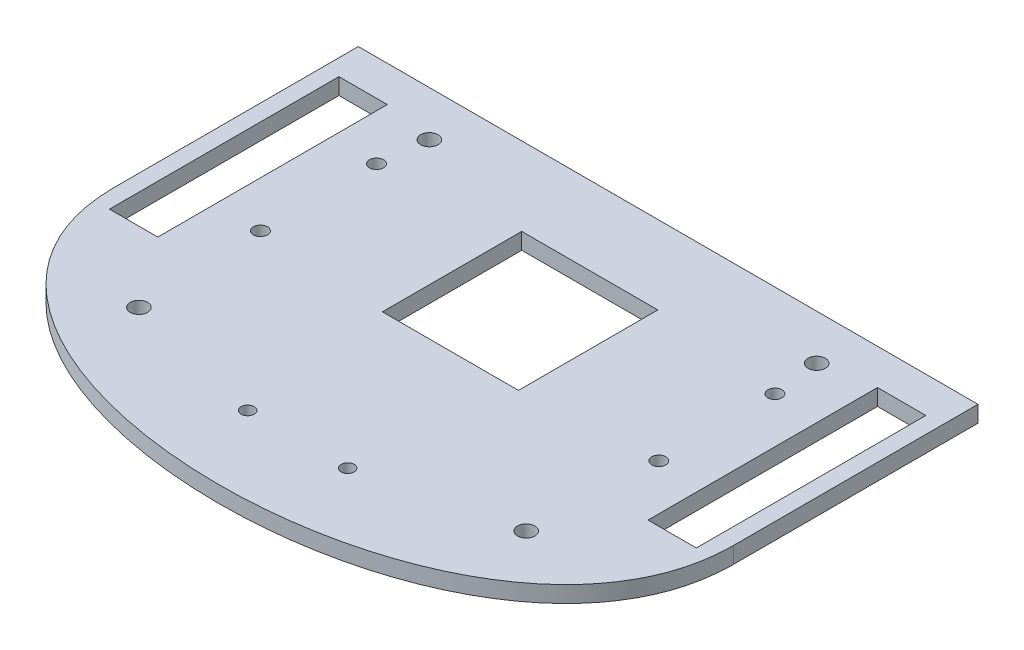
ISO-10303-21;
HEADER;
FILE_DESCRIPTION(('STEP AP214'),'2;1');
FILE_NAME('part.step','',(''),(''),'','','');
FILE_SCHEMA(('AUTOMOTIVE_DESIGN { 1 0 10303 214 1 1 1 1 }'));
ENDSEC;
DATA;
#1=APPLICATION_CONTEXT('core data for automotive mechanical design processes');
#2=APPLICATION_PROTOCOL_DEFINITION('international standard','automotive_design',2000,#1);
#3=PRODUCT_CONTEXT('',#1,'mechanical');
#4=PRODUCT('Part','Part','',(#3));
#5=PRODUCT_RELATED_PRODUCT_CATEGORY('part','',(#4));
#6=PRODUCT_DEFINITION_FORMATION('','',#4);
#7=PRODUCT_DEFINITION_CONTEXT('part definition',#1,'design');
#8=PRODUCT_DEFINITION('design','',#6,#7);
#9=PRODUCT_DEFINITION_SHAPE('','',#8);
#10=(LENGTH_UNIT() NAMED_UNIT(*) SI_UNIT(.MILLI.,.METRE.));
#11=(NAMED_UNIT(*) PLANE_ANGLE_UNIT() SI_UNIT($,.RADIAN.));
#12=(NAMED_UNIT(*) SI_UNIT($,.STERADIAN.) SOLID_ANGLE_UNIT());
#13=UNCERTAINTY_MEASURE_WITH_UNIT(LENGTH_MEASURE(1.E-05),#10,'distance_accuracy_value','');
#14=(GEOMETRIC_REPRESENTATION_CONTEXT(3) GLOBAL_UNCERTAINTY_ASSIGNED_CONTEXT((#13)) GLOBAL_UNIT_ASSIGNED_CONTEXT((#10,
#11,#12)) REPRESENTATION_CONTEXT('',''));
#15=CARTESIAN_POINT('',(0.,0.,0.));
#16=DIRECTION('',(0.,0.,1.));
#17=DIRECTION('',(1.,0.,0.));
#18=AXIS2_PLACEMENT_3D('',#15,#16,#17);
#19=CARTESIAN_POINT('',(-48.006,2.54,-34.798));
#20=DIRECTION('',(1.,0.,0.));
#21=DIRECTION('',(0.,0.,-1.));
#22=AXIS2_PLACEMENT_3D('',#19,#20,#21);
#23=PLANE('',#22);
#24=DIRECTION('',(0.,0.,1.));
#25=VECTOR('',#24,1.);
#26=CARTESIAN_POINT('',(-48.006,0.,-34.798));
#27=LINE('',#26,#25);
#28=CARTESIAN_POINT('',(-48.006,0.,-34.798));
#29=VERTEX_POINT('',#28);
#30=CARTESIAN_POINT('',(-48.006,0.,3.04800000000002));
#31=VERTEX_POINT('',#30);
#32=EDGE_CURVE('E314',#29,#31,#27,.T.);
#33=ORIENTED_EDGE('',*,*,#32,.T.);
#34=DIRECTION('',(0.,-1.,0.));
#35=VECTOR('',#34,1.);
#36=CARTESIAN_POINT('',(-48.006,2.54,3.04800000000002));
#37=LINE('',#36,#35);
#38=CARTESIAN_POINT('',(-48.006,2.54,3.04800000000002));
#39=VERTEX_POINT('',#38);
#40=EDGE_CURVE('E11',#39,#31,#37,.T.);
#41=ORIENTED_EDGE('',*,*,#40,.F.);
#42=DIRECTION('',(0.,0.,1.));
#43=VECTOR('',#42,1.);
#44=CARTESIAN_POINT('',(-48.006,2.54,-34.798));
#45=LINE('',#44,#43);
#46=CARTESIAN_POINT('',(-48.006,2.54,-34.798));
#47=VERTEX_POINT('',#46);
#48=EDGE_CURVE('E315',#47,#39,#45,.T.);
#49=ORIENTED_EDGE('',*,*,#48,.F.);
#50=DIRECTION('',(0.,-1.,0.));
#51=VECTOR('',#50,1.);
#52=CARTESIAN_POINT('',(-48.006,2.54,-34.798));
#53=LINE('',#52,#51);
#54=EDGE_CURVE('E441',#47,#29,#53,.T.);
#55=ORIENTED_EDGE('',*,*,#54,.T.);
#56=EDGE_LOOP('',(#33,#41,#49,#55));
#57=FACE_BOUND('',#56,.T.);
#58=ADVANCED_FACE('F32',(#57),#23,.F.);
#59=CARTESIAN_POINT('',(-48.006,2.54,3.04800000000002));
#60=CARTESIAN_POINT('',(-48.006,2.54,45.3813333333333));
#61=CARTESIAN_POINT('',(48.0060000000003,2.54,45.3813333333333));
#62=CARTESIAN_POINT('',(48.006,2.54,3.04800000000002));
#63=B_SPLINE_CURVE_WITH_KNOTS('',3,(#59,#60,#61,#62),.UNSPECIFIED.,.F.,.F.,(4,4),(0.,1.),.UNSPECIFIED.);
#64=DIRECTION('',(0.,-1.,0.));
#65=VECTOR('',#64,1.);
#66=SURFACE_OF_LINEAR_EXTRUSION('',#63,#65);
#67=CARTESIAN_POINT('',(-48.006,0.,3.04800000000002));
#68=CARTESIAN_POINT('',(-48.006,0.,45.3813333333333));
#69=CARTESIAN_POINT('',(48.0060000000003,0.,45.3813333333333));
#70=CARTESIAN_POINT('',(48.006,0.,3.04800000000002));
#71=B_SPLINE_CURVE_WITH_KNOTS('',3,(#67,#68,#69,#70),.UNSPECIFIED.,.F.,.F.,(4,4),(0.,1.),.UNSPECIFIED.);
#72=CARTESIAN_POINT('',(48.006,0.,3.04800000000002));
#73=VERTEX_POINT('',#72);
#74=EDGE_CURVE('E444',#31,#73,#71,.T.);
#75=ORIENTED_EDGE('',*,*,#74,.T.);
#76=DIRECTION('',(0.,-1.,0.));
#77=VECTOR('',#76,1.);
#78=CARTESIAN_POINT('',(48.006,2.54,3.04800000000002));
#79=LINE('',#78,#77);
#80=CARTESIAN_POINT('',(48.006,2.54,3.04800000000002));
#81=VERTEX_POINT('',#80);
#82=EDGE_CURVE('E39',#81,#73,#79,.T.);
#83=ORIENTED_EDGE('',*,*,#82,.F.);
#84=EDGE_CURVE('E318',#39,#81,#63,.T.);
#85=ORIENTED_EDGE('',*,*,#84,.F.);
#86=ORIENTED_EDGE('',*,*,#40,.T.);
#87=EDGE_LOOP('',(#75,#83,#85,#86));
#88=FACE_BOUND('',#87,.T.);
#89=ADVANCED_FACE('F329',(#88),#66,.F.);
#90=CARTESIAN_POINT('',(48.006,2.54,-34.798));
#91=DIRECTION('',(-1.,0.,0.));
#92=DIRECTION('',(0.,0.,1.));
#93=AXIS2_PLACEMENT_3D('',#90,#91,#92);
#94=PLANE('',#93);
#95=DIRECTION('',(0.,0.,-1.));
#96=VECTOR('',#95,1.);
#97=CARTESIAN_POINT('',(48.006,0.,-34.798));
#98=LINE('',#97,#96);
#99=CARTESIAN_POINT('',(48.006,0.,-34.798));
#100=VERTEX_POINT('',#99);
#101=EDGE_CURVE('E446',#73,#100,#98,.T.);
#102=ORIENTED_EDGE('',*,*,#101,.T.);
#103=DIRECTION('',(0.,-1.,0.));
#104=VECTOR('',#103,1.);
#105=CARTESIAN_POINT('',(48.006,2.54,-34.798));
#106=LINE('',#105,#104);
#107=CARTESIAN_POINT('',(48.006,2.54,-34.798));
#108=VERTEX_POINT('',#107);
#109=EDGE_CURVE('E458',#108,#100,#106,.T.);
#110=ORIENTED_EDGE('',*,*,#109,.F.);
#111=DIRECTION('',(0.,0.,-1.));
#112=VECTOR('',#111,1.);
#113=CARTESIAN_POINT('',(48.006,2.54,-34.798));
#114=LINE('',#113,#112);
#115=EDGE_CURVE('E324',#81,#108,#114,.T.);
#116=ORIENTED_EDGE('',*,*,#115,.F.);
#117=ORIENTED_EDGE('',*,*,#82,.T.);
#118=EDGE_LOOP('',(#102,#110,#116,#117));
#119=FACE_BOUND('',#118,.T.);
#120=ADVANCED_FACE('F332',(#119),#94,.F.);
#121=CARTESIAN_POINT('',(48.006,2.54,-34.798));
#122=DIRECTION('',(0.,0.,1.));
#123=DIRECTION('',(1.,0.,0.));
#124=AXIS2_PLACEMENT_3D('',#121,#122,#123);
#125=PLANE('',#124);
#126=DIRECTION('',(-1.,0.,0.));
#127=VECTOR('',#126,1.);
#128=CARTESIAN_POINT('',(48.006,0.,-34.798));
#129=LINE('',#128,#127);
#130=EDGE_CURVE('E319',#100,#29,#129,.T.);
#131=ORIENTED_EDGE('',*,*,#130,.T.);
#132=ORIENTED_EDGE('',*,*,#54,.F.);
#133=DIRECTION('',(-1.,0.,0.));
#134=VECTOR('',#133,1.);
#135=CARTESIAN_POINT('',(48.006,2.54,-34.798));
#136=LINE('',#135,#134);
#137=EDGE_CURVE('E448',#108,#47,#136,.T.);
#138=ORIENTED_EDGE('',*,*,#137,.F.);
#139=ORIENTED_EDGE('',*,*,#109,.T.);
#140=EDGE_LOOP('',(#131,#132,#138,#139));
#141=FACE_BOUND('',#140,.T.);
#142=ADVANCED_FACE('F336',(#141),#125,.F.);
#143=CARTESIAN_POINT('',(1.04083408558608E-13,2.54,34.798));
#144=DIRECTION('',(0.,-1.,0.));
#145=DIRECTION('',(0.,0.,-1.));
#146=AXIS2_PLACEMENT_3D('',#143,#144,#145);
#147=PLANE('',#146);
#148=DIRECTION('',(-1.,0.,0.));
#149=VECTOR('',#148,1.);
#150=CARTESIAN_POINT('',(1.23874952735081E-13,2.54,6.30200000000002));
#151=LINE('',#150,#149);
#152=CARTESIAN_POINT('',(-37.973,2.54,6.30199999999999));
#153=VERTEX_POINT('',#152);
#154=CARTESIAN_POINT('',(-45.466,2.54,6.30199999999999));
#155=VERTEX_POINT('',#154);
#156=EDGE_CURVE('E305',#153,#155,#151,.T.);
#157=ORIENTED_EDGE('',*,*,#156,.T.);
#158=DIRECTION('',(0.,0.,-1.));
#159=VECTOR('',#158,1.);
#160=CARTESIAN_POINT('',(-45.4659999999999,2.54,34.7980000000001));
#161=LINE('',#160,#159);
#162=CARTESIAN_POINT('',(-45.466,2.54,-29.258));
#163=VERTEX_POINT('',#162);
#164=EDGE_CURVE('E149',#155,#163,#161,.T.);
#165=ORIENTED_EDGE('',*,*,#164,.T.);
#166=DIRECTION('',(1.,0.,0.));
#167=VECTOR('',#166,1.);
#168=CARTESIAN_POINT('',(0.,2.54,-29.258));
#169=LINE('',#168,#167);
#170=CARTESIAN_POINT('',(-37.973,2.54,-29.258));
#171=VERTEX_POINT('',#170);
#172=EDGE_CURVE('E310',#163,#171,#169,.T.);
#173=ORIENTED_EDGE('',*,*,#172,.T.);
#174=DIRECTION('',(0.,0.,1.));
#175=VECTOR('',#174,1.);
#176=CARTESIAN_POINT('',(-37.973,2.54,34.798));
#177=LINE('',#176,#175);
#178=EDGE_CURVE('E307',#171,#153,#177,.T.);
#179=ORIENTED_EDGE('',*,*,#178,.T.);
#180=EDGE_LOOP('',(#157,#165,#173,#179));
#181=FACE_BOUND('',#180,.T.);
#182=CARTESIAN_POINT('',(30.,2.54,-27.798));
#183=DIRECTION('',(0.,-1.,0.));
#184=DIRECTION('',(0.,0.,-1.));
#185=AXIS2_PLACEMENT_3D('',#182,#183,#184);
#186=CIRCLE('',#185,1.35);
#187=CARTESIAN_POINT('',(30.,2.54,-29.148));
#188=VERTEX_POINT('',#187);
#189=EDGE_CURVE('E302',#188,#188,#186,.T.);
#190=ORIENTED_EDGE('',*,*,#189,.T.);
#191=EDGE_LOOP('',(#190));
#192=FACE_BOUND('',#191,.T.);
#193=CARTESIAN_POINT('',(-7.747,2.54,22.606));
#194=DIRECTION('',(0.,-1.,0.));
#195=DIRECTION('',(0.,0.,-1.));
#196=AXIS2_PLACEMENT_3D('',#193,#194,#195);
#197=CIRCLE('',#196,1.016);
#198=CARTESIAN_POINT('',(-7.747,2.54,21.59));
#199=VERTEX_POINT('',#198);
#200=EDGE_CURVE('E299',#199,#199,#197,.T.);
#201=ORIENTED_EDGE('',*,*,#200,.T.);
#202=EDGE_LOOP('',(#201));
#203=FACE_BOUND('',#202,.T.);
#204=DIRECTION('',(-1.,0.,0.));
#205=VECTOR('',#204,1.);
#206=CARTESIAN_POINT('',(1.04083408558608E-13,2.54,-1.064));
#207=LINE('',#206,#205);
#208=CARTESIAN_POINT('',(10.541,2.54,-1.064));
#209=VERTEX_POINT('',#208);
#210=CARTESIAN_POINT('',(-10.541,2.54,-1.064));
#211=VERTEX_POINT('',#210);
#212=EDGE_CURVE('E287',#209,#211,#207,.T.);
#213=ORIENTED_EDGE('',*,*,#212,.T.);
#214=DIRECTION('',(0.,0.,-1.));
#215=VECTOR('',#214,1.);
#216=CARTESIAN_POINT('',(-10.541,2.54,34.798));
#217=LINE('',#216,#215);
#218=CARTESIAN_POINT('',(-10.541,2.54,-22.654));
#219=VERTEX_POINT('',#218);
#220=EDGE_CURVE('E296',#211,#219,#217,.T.);
#221=ORIENTED_EDGE('',*,*,#220,.T.);
#222=DIRECTION('',(1.,0.,0.));
#223=VECTOR('',#222,1.);
#224=CARTESIAN_POINT('',(1.04083408558608E-13,2.54,-22.654));
#225=LINE('',#224,#223);
#226=CARTESIAN_POINT('',(10.541,2.54,-22.654));
#227=VERTEX_POINT('',#226);
#228=EDGE_CURVE('E293',#219,#227,#225,.T.);
#229=ORIENTED_EDGE('',*,*,#228,.T.);
#230=DIRECTION('',(0.,0.,1.));
#231=VECTOR('',#230,1.);
#232=CARTESIAN_POINT('',(10.541,2.54,34.798));
#233=LINE('',#232,#231);
#234=EDGE_CURVE('E290',#227,#209,#233,.T.);
#235=ORIENTED_EDGE('',*,*,#234,.T.);
#236=EDGE_LOOP('',(#213,#221,#229,#235));
#237=FACE_BOUND('',#236,.T.);
#238=CARTESIAN_POINT('',(7.747,2.54,22.606));
#239=DIRECTION('',(0.,-1.,0.));
#240=DIRECTION('',(0.,0.,-1.));
#241=AXIS2_PLACEMENT_3D('',#238,#239,#240);
#242=CIRCLE('',#241,1.016);
#243=CARTESIAN_POINT('',(7.747,2.54,21.59));
#244=VERTEX_POINT('',#243);
#245=EDGE_CURVE('E284',#244,#244,#242,.T.);
#246=ORIENTED_EDGE('',*,*,#245,.T.);
#247=EDGE_LOOP('',(#246));
#248=FACE_BOUND('',#247,.T.);
#249=CARTESIAN_POINT('',(-30.861,2.54,-2.4864));
#250=DIRECTION('',(0.,-1.,0.));
#251=DIRECTION('',(0.,0.,-1.));
#252=AXIS2_PLACEMENT_3D('',#249,#250,#251);
#253=CIRCLE('',#252,1.0922);
#254=CARTESIAN_POINT('',(-30.861,2.54,-3.5786));
#255=VERTEX_POINT('',#254);
#256=EDGE_CURVE('E281',#255,#255,#253,.T.);
#257=ORIENTED_EDGE('',*,*,#256,.T.);
#258=EDGE_LOOP('',(#257));
#259=FACE_BOUND('',#258,.T.);
#260=CARTESIAN_POINT('',(-30.,2.54,-27.798));
#261=DIRECTION('',(0.,-1.,0.));
#262=DIRECTION('',(0.,0.,-1.));
#263=AXIS2_PLACEMENT_3D('',#260,#261,#262);
#264=CIRCLE('',#263,1.35);
#265=CARTESIAN_POINT('',(-30.,2.54,-29.148));
#266=VERTEX_POINT('',#265);
#267=EDGE_CURVE('E278',#266,#266,#264,.T.);
#268=ORIENTED_EDGE('',*,*,#267,.T.);
#269=EDGE_LOOP('',(#268));
#270=FACE_BOUND('',#269,.T.);
#271=CARTESIAN_POINT('',(-30.861,2.54,-20.4696));
#272=DIRECTION('',(0.,-1.,0.));
#273=DIRECTION('',(0.,0.,-1.));
#274=AXIS2_PLACEMENT_3D('',#271,#272,#273);
#275=CIRCLE('',#274,1.0922);
#276=CARTESIAN_POINT('',(-30.861,2.54,-21.5618));
#277=VERTEX_POINT('',#276);
#278=EDGE_CURVE('E275',#277,#277,#275,.T.);
#279=ORIENTED_EDGE('',*,*,#278,.T.);
#280=EDGE_LOOP('',(#279));
#281=FACE_BOUND('',#280,.T.);
#282=DIRECTION('',(0.,0.,-1.));
#283=VECTOR('',#282,1.);
#284=CARTESIAN_POINT('',(37.973,2.54,34.798));
#285=LINE('',#284,#283);
#286=CARTESIAN_POINT('',(37.973,2.54,6.30199999999999));
#287=VERTEX_POINT('',#286);
#288=CARTESIAN_POINT('',(37.973,2.54,-29.258));
#289=VERTEX_POINT('',#288);
#290=EDGE_CURVE('E263',#287,#289,#285,.T.);
#291=ORIENTED_EDGE('',*,*,#290,.T.);
#292=DIRECTION('',(1.,0.,0.));
#293=VECTOR('',#292,1.);
#294=CARTESIAN_POINT('',(1.63402478077984E-13,2.54,-29.258));
#295=LINE('',#294,#293);
#296=CARTESIAN_POINT('',(45.466,2.54,-29.258));
#297=VERTEX_POINT('',#296);
#298=EDGE_CURVE('E272',#289,#297,#295,.T.);
#299=ORIENTED_EDGE('',*,*,#298,.T.);
#300=DIRECTION('',(0.,0.,1.));
#301=VECTOR('',#300,1.);
#302=CARTESIAN_POINT('',(45.466,2.54,34.798));
#303=LINE('',#302,#301);
#304=CARTESIAN_POINT('',(45.466,2.54,6.30199999999999));
#305=VERTEX_POINT('',#304);
#306=EDGE_CURVE('E269',#297,#305,#303,.T.);
#307=ORIENTED_EDGE('',*,*,#306,.T.);
#308=DIRECTION('',(-1.,0.,0.));
#309=VECTOR('',#308,1.);
#310=CARTESIAN_POINT('',(0.,2.54,6.30200000000002));
#311=LINE('',#310,#309);
#312=EDGE_CURVE('E266',#305,#287,#311,.T.);
#313=ORIENTED_EDGE('',*,*,#312,.T.);
#314=EDGE_LOOP('',(#291,#299,#307,#313));
#315=FACE_BOUND('',#314,.T.);
#316=CARTESIAN_POINT('',(30.861,2.54,-2.4864));
#317=DIRECTION('',(0.,-1.,0.));
#318=DIRECTION('',(0.,0.,-1.));
#319=AXIS2_PLACEMENT_3D('',#316,#317,#318);
#320=CIRCLE('',#319,1.09219999999998);
#321=CARTESIAN_POINT('',(30.861,2.54,-3.57859999999999));
#322=VERTEX_POINT('',#321);
#323=EDGE_CURVE('E260',#322,#322,#320,.T.);
#324=ORIENTED_EDGE('',*,*,#323,.T.);
#325=EDGE_LOOP('',(#324));
#326=FACE_BOUND('',#325,.T.);
#327=CARTESIAN_POINT('',(30.861,2.54,-20.4696));
#328=DIRECTION('',(0.,-1.,0.));
#329=DIRECTION('',(0.,0.,-1.));
#330=AXIS2_PLACEMENT_3D('',#327,#328,#329);
#331=CIRCLE('',#330,1.09219999999999);
#332=CARTESIAN_POINT('',(30.861,2.54,-21.5618));
#333=VERTEX_POINT('',#332);
#334=EDGE_CURVE('E257',#333,#333,#331,.T.);
#335=ORIENTED_EDGE('',*,*,#334,.T.);
#336=EDGE_LOOP('',(#335));
#337=FACE_BOUND('',#336,.T.);
#338=CARTESIAN_POINT('',(-30.,2.54,17.202));
#339=DIRECTION('',(0.,-1.,0.));
#340=DIRECTION('',(0.,0.,-1.));
#341=AXIS2_PLACEMENT_3D('',#338,#339,#340);
#342=CIRCLE('',#341,1.35);
#343=CARTESIAN_POINT('',(-30.,2.54,15.852));
#344=VERTEX_POINT('',#343);
#345=EDGE_CURVE('E254',#344,#344,#342,.T.);
#346=ORIENTED_EDGE('',*,*,#345,.T.);
#347=EDGE_LOOP('',(#346));
#348=FACE_BOUND('',#347,.T.);
#349=CARTESIAN_POINT('',(30.,2.54,17.202));
#350=DIRECTION('',(0.,-1.,0.));
#351=DIRECTION('',(0.,0.,-1.));
#352=AXIS2_PLACEMENT_3D('',#349,#350,#351);
#353=CIRCLE('',#352,1.35);
#354=CARTESIAN_POINT('',(30.,2.54,15.852));
#355=VERTEX_POINT('',#354);
#356=EDGE_CURVE('E176',#355,#355,#353,.T.);
#357=ORIENTED_EDGE('',*,*,#356,.T.);
#358=EDGE_LOOP('',(#357));
#359=FACE_BOUND('',#358,.T.);
#360=ORIENTED_EDGE('',*,*,#48,.T.);
#361=ORIENTED_EDGE('',*,*,#84,.T.);
#362=ORIENTED_EDGE('',*,*,#115,.T.);
#363=ORIENTED_EDGE('',*,*,#137,.T.);
#364=EDGE_LOOP('',(#360,#361,#362,#363));
#365=FACE_BOUND('',#364,.T.);
#366=ADVANCED_FACE('F340',(#181,#192,#203,#237,#248,#259,#270,#281,#315,#326,#337,#348,#359,
#365),#147,.F.);
#367=CARTESIAN_POINT('',(1.04083408558608E-13,0.,34.798));
#368=DIRECTION('',(0.,-1.,0.));
#369=DIRECTION('',(0.,0.,-1.));
#370=AXIS2_PLACEMENT_3D('',#367,#368,#369);
#371=PLANE('',#370);
#372=DIRECTION('',(0.,0.,1.));
#373=VECTOR('',#372,1.);
#374=CARTESIAN_POINT('',(-45.466,0.,-29.258));
#375=LINE('',#374,#373);
#376=CARTESIAN_POINT('',(-45.466,0.,-29.258));
#377=VERTEX_POINT('',#376);
#378=CARTESIAN_POINT('',(-45.466,0.,6.30199999999999));
#379=VERTEX_POINT('',#378);
#380=EDGE_CURVE('E146',#377,#379,#375,.T.);
#381=ORIENTED_EDGE('',*,*,#380,.T.);
#382=DIRECTION('',(1.,0.,0.));
#383=VECTOR('',#382,1.);
#384=CARTESIAN_POINT('',(-45.466,0.,6.30199999999999));
#385=LINE('',#384,#383);
#386=CARTESIAN_POINT('',(-37.973,0.,6.30199999999999));
#387=VERTEX_POINT('',#386);
#388=EDGE_CURVE('E156',#379,#387,#385,.T.);
#389=ORIENTED_EDGE('',*,*,#388,.T.);
#390=DIRECTION('',(0.,0.,-1.));
#391=VECTOR('',#390,1.);
#392=CARTESIAN_POINT('',(-37.973,0.,-29.258));
#393=LINE('',#392,#391);
#394=CARTESIAN_POINT('',(-37.973,0.,-29.258));
#395=VERTEX_POINT('',#394);
#396=EDGE_CURVE('E161',#387,#395,#393,.T.);
#397=ORIENTED_EDGE('',*,*,#396,.T.);
#398=DIRECTION('',(-1.,0.,0.));
#399=VECTOR('',#398,1.);
#400=CARTESIAN_POINT('',(-45.466,0.,-29.258));
#401=LINE('',#400,#399);
#402=EDGE_CURVE('E152',#395,#377,#401,.T.);
#403=ORIENTED_EDGE('',*,*,#402,.T.);
#404=EDGE_LOOP('',(#381,#389,#397,#403));
#405=FACE_BOUND('',#404,.T.);
#406=CARTESIAN_POINT('',(30.,0.,-27.798));
#407=DIRECTION('',(0.,1.,0.));
#408=DIRECTION('',(0.,0.,-1.));
#409=AXIS2_PLACEMENT_3D('',#406,#407,#408);
#410=CIRCLE('',#409,1.35);
#411=CARTESIAN_POINT('',(30.,0.,-29.148));
#412=VERTEX_POINT('',#411);
#413=EDGE_CURVE('E207',#412,#412,#410,.T.);
#414=ORIENTED_EDGE('',*,*,#413,.T.);
#415=EDGE_LOOP('',(#414));
#416=FACE_BOUND('',#415,.T.);
#417=CARTESIAN_POINT('',(-7.747,0.,22.606));
#418=DIRECTION('',(0.,1.,0.));
#419=DIRECTION('',(0.,0.,1.));
#420=AXIS2_PLACEMENT_3D('',#417,#418,#419);
#421=CIRCLE('',#420,1.016);
#422=CARTESIAN_POINT('',(-7.747,0.,23.622));
#423=VERTEX_POINT('',#422);
#424=EDGE_CURVE('E197',#423,#423,#421,.T.);
#425=ORIENTED_EDGE('',*,*,#424,.T.);
#426=EDGE_LOOP('',(#425));
#427=FACE_BOUND('',#426,.T.);
#428=DIRECTION('',(0.,0.,1.));
#429=VECTOR('',#428,1.);
#430=CARTESIAN_POINT('',(-10.541,0.,-22.654));
#431=LINE('',#430,#429);
#432=CARTESIAN_POINT('',(-10.541,0.,-22.654));
#433=VERTEX_POINT('',#432);
#434=CARTESIAN_POINT('',(-10.541,0.,-1.064));
#435=VERTEX_POINT('',#434);
#436=EDGE_CURVE('E181',#433,#435,#431,.T.);
#437=ORIENTED_EDGE('',*,*,#436,.T.);
#438=DIRECTION('',(1.,0.,0.));
#439=VECTOR('',#438,1.);
#440=CARTESIAN_POINT('',(-10.541,0.,-1.064));
#441=LINE('',#440,#439);
#442=CARTESIAN_POINT('',(10.541,0.,-1.064));
#443=VERTEX_POINT('',#442);
#444=EDGE_CURVE('E184',#435,#443,#441,.T.);
#445=ORIENTED_EDGE('',*,*,#444,.T.);
#446=DIRECTION('',(0.,0.,-1.));
#447=VECTOR('',#446,1.);
#448=CARTESIAN_POINT('',(10.541,0.,-22.654));
#449=LINE('',#448,#447);
#450=CARTESIAN_POINT('',(10.541,0.,-22.654));
#451=VERTEX_POINT('',#450);
#452=EDGE_CURVE('E188',#443,#451,#449,.T.);
#453=ORIENTED_EDGE('',*,*,#452,.T.);
#454=DIRECTION('',(-1.,0.,0.));
#455=VECTOR('',#454,1.);
#456=CARTESIAN_POINT('',(-10.541,0.,-22.654));
#457=LINE('',#456,#455);
#458=EDGE_CURVE('E191',#451,#433,#457,.T.);
#459=ORIENTED_EDGE('',*,*,#458,.T.);
#460=EDGE_LOOP('',(#437,#445,#453,#459));
#461=FACE_BOUND('',#460,.T.);
#462=CARTESIAN_POINT('',(7.747,0.,22.606));
#463=DIRECTION('',(0.,1.,0.));
#464=DIRECTION('',(0.,0.,-1.));
#465=AXIS2_PLACEMENT_3D('',#462,#463,#464);
#466=CIRCLE('',#465,1.016);
#467=CARTESIAN_POINT('',(7.747,0.,21.59));
#468=VERTEX_POINT('',#467);
#469=EDGE_CURVE('E185',#468,#468,#466,.T.);
#470=ORIENTED_EDGE('',*,*,#469,.T.);
#471=EDGE_LOOP('',(#470));
#472=FACE_BOUND('',#471,.T.);
#473=CARTESIAN_POINT('',(-30.861,0.,-2.4864));
#474=DIRECTION('',(0.,1.,0.));
#475=DIRECTION('',(0.,0.,1.));
#476=AXIS2_PLACEMENT_3D('',#473,#474,#475);
#477=CIRCLE('',#476,1.0922);
#478=CARTESIAN_POINT('',(-30.861,0.,-1.3942));
#479=VERTEX_POINT('',#478);
#480=EDGE_CURVE('E216',#479,#479,#477,.T.);
#481=ORIENTED_EDGE('',*,*,#480,.T.);
#482=EDGE_LOOP('',(#481));
#483=FACE_BOUND('',#482,.T.);
#484=CARTESIAN_POINT('',(-30.,0.,-27.798));
#485=DIRECTION('',(0.,1.,0.));
#486=DIRECTION('',(0.,0.,1.));
#487=AXIS2_PLACEMENT_3D('',#484,#485,#486);
#488=CIRCLE('',#487,1.35);
#489=CARTESIAN_POINT('',(-30.,0.,-26.448));
#490=VERTEX_POINT('',#489);
#491=EDGE_CURVE('E225',#490,#490,#488,.T.);
#492=ORIENTED_EDGE('',*,*,#491,.T.);
#493=EDGE_LOOP('',(#492));
#494=FACE_BOUND('',#493,.T.);
#495=CARTESIAN_POINT('',(-30.861,0.,-20.4696));
#496=DIRECTION('',(0.,1.,0.));
#497=DIRECTION('',(0.,0.,1.));
#498=AXIS2_PLACEMENT_3D('',#495,#496,#497);
#499=CIRCLE('',#498,1.0922);
#500=CARTESIAN_POINT('',(-30.861,0.,-19.3774));
#501=VERTEX_POINT('',#500);
#502=EDGE_CURVE('E228',#501,#501,#499,.T.);
#503=ORIENTED_EDGE('',*,*,#502,.T.);
#504=EDGE_LOOP('',(#503));
#505=FACE_BOUND('',#504,.T.);
#506=DIRECTION('',(-1.,0.,0.));
#507=VECTOR('',#506,1.);
#508=CARTESIAN_POINT('',(45.466,0.,-29.258));
#509=LINE('',#508,#507);
#510=CARTESIAN_POINT('',(45.466,0.,-29.258));
#511=VERTEX_POINT('',#510);
#512=CARTESIAN_POINT('',(37.973,0.,-29.258));
#513=VERTEX_POINT('',#512);
#514=EDGE_CURVE('E231',#511,#513,#509,.T.);
#515=ORIENTED_EDGE('',*,*,#514,.T.);
#516=DIRECTION('',(0.,0.,1.));
#517=VECTOR('',#516,1.);
#518=CARTESIAN_POINT('',(37.973,0.,-29.258));
#519=LINE('',#518,#517);
#520=CARTESIAN_POINT('',(37.973,0.,6.30199999999999));
#521=VERTEX_POINT('',#520);
#522=EDGE_CURVE('E234',#513,#521,#519,.T.);
#523=ORIENTED_EDGE('',*,*,#522,.T.);
#524=DIRECTION('',(1.,0.,0.));
#525=VECTOR('',#524,1.);
#526=CARTESIAN_POINT('',(45.466,0.,6.30199999999999));
#527=LINE('',#526,#525);
#528=CARTESIAN_POINT('',(45.466,0.,6.30199999999999));
#529=VERTEX_POINT('',#528);
#530=EDGE_CURVE('E237',#521,#529,#527,.T.);
#531=ORIENTED_EDGE('',*,*,#530,.T.);
#532=DIRECTION('',(0.,0.,-1.));
#533=VECTOR('',#532,1.);
#534=CARTESIAN_POINT('',(45.466,0.,-29.258));
#535=LINE('',#534,#533);
#536=EDGE_CURVE('E240',#529,#511,#535,.T.);
#537=ORIENTED_EDGE('',*,*,#536,.T.);
#538=EDGE_LOOP('',(#515,#523,#531,#537));
#539=FACE_BOUND('',#538,.T.);
#540=CARTESIAN_POINT('',(30.861,0.,-2.4864));
#541=DIRECTION('',(0.,1.,0.));
#542=DIRECTION('',(0.,0.,-1.));
#543=AXIS2_PLACEMENT_3D('',#540,#541,#542);
#544=CIRCLE('',#543,1.09219999999998);
#545=CARTESIAN_POINT('',(30.861,0.,-3.57859999999999));
#546=VERTEX_POINT('',#545);
#547=EDGE_CURVE('E213',#546,#546,#544,.T.);
#548=ORIENTED_EDGE('',*,*,#547,.T.);
#549=EDGE_LOOP('',(#548));
#550=FACE_BOUND('',#549,.T.);
#551=CARTESIAN_POINT('',(30.861,0.,-20.4696));
#552=DIRECTION('',(0.,1.,0.));
#553=DIRECTION('',(0.,0.,-1.));
#554=AXIS2_PLACEMENT_3D('',#551,#552,#553);
#555=CIRCLE('',#554,1.09219999999999);
#556=CARTESIAN_POINT('',(30.861,0.,-21.5618));
#557=VERTEX_POINT('',#556);
#558=EDGE_CURVE('E217',#557,#557,#555,.T.);
#559=ORIENTED_EDGE('',*,*,#558,.T.);
#560=EDGE_LOOP('',(#559));
#561=FACE_BOUND('',#560,.T.);
#562=CARTESIAN_POINT('',(-30.,0.,17.202));
#563=DIRECTION('',(0.,1.,0.));
#564=DIRECTION('',(0.,0.,1.));
#565=AXIS2_PLACEMENT_3D('',#562,#563,#564);
#566=CIRCLE('',#565,1.35);
#567=CARTESIAN_POINT('',(-30.,0.,18.552));
#568=VERTEX_POINT('',#567);
#569=EDGE_CURVE('E220',#568,#568,#566,.T.);
#570=ORIENTED_EDGE('',*,*,#569,.T.);
#571=EDGE_LOOP('',(#570));
#572=FACE_BOUND('',#571,.T.);
#573=CARTESIAN_POINT('',(30.,0.,17.202));
#574=DIRECTION('',(0.,1.,0.));
#575=DIRECTION('',(0.,0.,-1.));
#576=AXIS2_PLACEMENT_3D('',#573,#574,#575);
#577=CIRCLE('',#576,1.35);
#578=CARTESIAN_POINT('',(30.,0.,15.852));
#579=VERTEX_POINT('',#578);
#580=EDGE_CURVE('E210',#579,#579,#577,.T.);
#581=ORIENTED_EDGE('',*,*,#580,.T.);
#582=EDGE_LOOP('',(#581));
#583=FACE_BOUND('',#582,.T.);
#584=ORIENTED_EDGE('',*,*,#32,.F.);
#585=ORIENTED_EDGE('',*,*,#130,.F.);
#586=ORIENTED_EDGE('',*,*,#101,.F.);
#587=ORIENTED_EDGE('',*,*,#74,.F.);
#588=EDGE_LOOP('',(#584,#585,#586,#587));
#589=FACE_BOUND('',#588,.T.);
#590=ADVANCED_FACE('F163',(#405,#416,#427,#461,#472,#483,#494,#505,#539,#550,#561,#572,#583,
#589),#371,.T.);
#591=CARTESIAN_POINT('',(30.,0.,17.202));
#592=DIRECTION('',(0.,1.,0.));
#593=DIRECTION('',(0.,0.,1.));
#594=AXIS2_PLACEMENT_3D('',#591,#592,#593);
#595=CYLINDRICAL_SURFACE('',#594,1.35);
#596=ORIENTED_EDGE('',*,*,#580,.F.);
#597=EDGE_LOOP('',(#596));
#598=FACE_BOUND('',#597,.T.);
#599=ORIENTED_EDGE('',*,*,#356,.F.);
#600=EDGE_LOOP('',(#599));
#601=FACE_BOUND('',#600,.T.);
#602=ADVANCED_FACE('F344',(#598,#601),#595,.F.);
#603=CARTESIAN_POINT('',(-30.,0.,17.202));
#604=DIRECTION('',(0.,1.,0.));
#605=DIRECTION('',(0.,0.,1.));
#606=AXIS2_PLACEMENT_3D('',#603,#604,#605);
#607=CYLINDRICAL_SURFACE('',#606,1.35);
#608=ORIENTED_EDGE('',*,*,#569,.F.);
#609=EDGE_LOOP('',(#608));
#610=FACE_BOUND('',#609,.T.);
#611=ORIENTED_EDGE('',*,*,#345,.F.);
#612=EDGE_LOOP('',(#611));
#613=FACE_BOUND('',#612,.T.);
#614=ADVANCED_FACE('F380',(#610,#613),#607,.F.);
#615=CARTESIAN_POINT('',(30.861,0.,-20.4696));
#616=DIRECTION('',(0.,1.,0.));
#617=DIRECTION('',(0.,0.,1.));
#618=AXIS2_PLACEMENT_3D('',#615,#616,#617);
#619=CYLINDRICAL_SURFACE('',#618,1.09219999999999);
#620=ORIENTED_EDGE('',*,*,#558,.F.);
#621=EDGE_LOOP('',(#620));
#622=FACE_BOUND('',#621,.T.);
#623=ORIENTED_EDGE('',*,*,#334,.F.);
#624=EDGE_LOOP('',(#623));
#625=FACE_BOUND('',#624,.T.);
#626=ADVANCED_FACE('F384',(#622,#625),#619,.F.);
#627=CARTESIAN_POINT('',(30.861,0.,-2.4864));
#628=DIRECTION('',(0.,1.,0.));
#629=DIRECTION('',(0.,0.,1.));
#630=AXIS2_PLACEMENT_3D('',#627,#628,#629);
#631=CYLINDRICAL_SURFACE('',#630,1.09219999999998);
#632=ORIENTED_EDGE('',*,*,#547,.F.);
#633=EDGE_LOOP('',(#632));
#634=FACE_BOUND('',#633,.T.);
#635=ORIENTED_EDGE('',*,*,#323,.F.);
#636=EDGE_LOOP('',(#635));
#637=FACE_BOUND('',#636,.T.);
#638=ADVANCED_FACE('F358',(#634,#637),#631,.F.);
#639=CARTESIAN_POINT('',(45.466,0.,-29.258));
#640=DIRECTION('',(0.,0.,-1.));
#641=DIRECTION('',(-1.,0.,0.));
#642=AXIS2_PLACEMENT_3D('',#639,#640,#641);
#643=PLANE('',#642);
#644=DIRECTION('',(0.,1.,0.));
#645=VECTOR('',#644,1.);
#646=CARTESIAN_POINT('',(37.973,0.,-29.258));
#647=LINE('',#646,#645);
#648=EDGE_CURVE('E242',#513,#289,#647,.T.);
#649=ORIENTED_EDGE('',*,*,#648,.F.);
#650=ORIENTED_EDGE('',*,*,#514,.F.);
#651=DIRECTION('',(0.,1.,0.));
#652=VECTOR('',#651,1.);
#653=CARTESIAN_POINT('',(45.466,0.,-29.258));
#654=LINE('',#653,#652);
#655=EDGE_CURVE('E166',#511,#297,#654,.T.);
#656=ORIENTED_EDGE('',*,*,#655,.T.);
#657=ORIENTED_EDGE('',*,*,#298,.F.);
#658=EDGE_LOOP('',(#649,#650,#656,#657));
#659=FACE_BOUND('',#658,.T.);
#660=ADVANCED_FACE('F354',(#659),#643,.F.);
#661=CARTESIAN_POINT('',(45.466,0.,-29.258));
#662=DIRECTION('',(1.,0.,0.));
#663=DIRECTION('',(0.,0.,-1.));
#664=AXIS2_PLACEMENT_3D('',#661,#662,#663);
#665=PLANE('',#664);
#666=ORIENTED_EDGE('',*,*,#655,.F.);
#667=ORIENTED_EDGE('',*,*,#536,.F.);
#668=DIRECTION('',(0.,1.,0.));
#669=VECTOR('',#668,1.);
#670=CARTESIAN_POINT('',(45.466,0.,6.30199999999999));
#671=LINE('',#670,#669);
#672=EDGE_CURVE('E169',#529,#305,#671,.T.);
#673=ORIENTED_EDGE('',*,*,#672,.T.);
#674=ORIENTED_EDGE('',*,*,#306,.F.);
#675=EDGE_LOOP('',(#666,#667,#673,#674));
#676=FACE_BOUND('',#675,.T.);
#677=ADVANCED_FACE('F357',(#676),#665,.F.);
#678=CARTESIAN_POINT('',(45.466,0.,6.30199999999999));
#679=DIRECTION('',(0.,0.,1.));
#680=DIRECTION('',(1.,0.,0.));
#681=AXIS2_PLACEMENT_3D('',#678,#679,#680);
#682=PLANE('',#681);
#683=ORIENTED_EDGE('',*,*,#672,.F.);
#684=ORIENTED_EDGE('',*,*,#530,.F.);
#685=DIRECTION('',(0.,1.,0.));
#686=VECTOR('',#685,1.);
#687=CARTESIAN_POINT('',(37.973,0.,6.30199999999999));
#688=LINE('',#687,#686);
#689=EDGE_CURVE('E246',#521,#287,#688,.T.);
#690=ORIENTED_EDGE('',*,*,#689,.T.);
#691=ORIENTED_EDGE('',*,*,#312,.F.);
#692=EDGE_LOOP('',(#683,#684,#690,#691));
#693=FACE_BOUND('',#692,.T.);
#694=ADVANCED_FACE('F362',(#693),#682,.F.);
#695=CARTESIAN_POINT('',(37.973,0.,-29.258));
#696=DIRECTION('',(-1.,0.,0.));
#697=DIRECTION('',(0.,0.,1.));
#698=AXIS2_PLACEMENT_3D('',#695,#696,#697);
#699=PLANE('',#698);
#700=ORIENTED_EDGE('',*,*,#689,.F.);
#701=ORIENTED_EDGE('',*,*,#522,.F.);
#702=ORIENTED_EDGE('',*,*,#648,.T.);
#703=ORIENTED_EDGE('',*,*,#290,.F.);
#704=EDGE_LOOP('',(#700,#701,#702,#703));
#705=FACE_BOUND('',#704,.T.);
#706=ADVANCED_FACE('F352',(#705),#699,.F.);
#707=CARTESIAN_POINT('',(-30.861,0.,-20.4696));
#708=DIRECTION('',(0.,1.,0.));
#709=DIRECTION('',(0.,0.,1.));
#710=AXIS2_PLACEMENT_3D('',#707,#708,#709);
#711=CYLINDRICAL_SURFACE('',#710,1.0922);
#712=ORIENTED_EDGE('',*,*,#502,.F.);
#713=EDGE_LOOP('',(#712));
#714=FACE_BOUND('',#713,.T.);
#715=ORIENTED_EDGE('',*,*,#278,.F.);
#716=EDGE_LOOP('',(#715));
#717=FACE_BOUND('',#716,.T.);
#718=ADVANCED_FACE('F348',(#714,#717),#711,.F.);
#719=CARTESIAN_POINT('',(-30.,0.,-27.798));
#720=DIRECTION('',(0.,1.,0.));
#721=DIRECTION('',(0.,0.,1.));
#722=AXIS2_PLACEMENT_3D('',#719,#720,#721);
#723=CYLINDRICAL_SURFACE('',#722,1.35);
#724=ORIENTED_EDGE('',*,*,#491,.F.);
#725=EDGE_LOOP('',(#724));
#726=FACE_BOUND('',#725,.T.);
#727=ORIENTED_EDGE('',*,*,#267,.F.);
#728=EDGE_LOOP('',(#727));
#729=FACE_BOUND('',#728,.T.);
#730=ADVANCED_FACE('F351',(#726,#729),#723,.F.);
#731=CARTESIAN_POINT('',(-30.861,0.,-2.4864));
#732=DIRECTION('',(0.,1.,0.));
#733=DIRECTION('',(0.,0.,1.));
#734=AXIS2_PLACEMENT_3D('',#731,#732,#733);
#735=CYLINDRICAL_SURFACE('',#734,1.0922);
#736=ORIENTED_EDGE('',*,*,#480,.F.);
#737=EDGE_LOOP('',(#736));
#738=FACE_BOUND('',#737,.T.);
#739=ORIENTED_EDGE('',*,*,#256,.F.);
#740=EDGE_LOOP('',(#739));
#741=FACE_BOUND('',#740,.T.);
#742=ADVANCED_FACE('F370',(#738,#741),#735,.F.);
#743=CARTESIAN_POINT('',(7.747,0.,22.606));
#744=DIRECTION('',(0.,1.,0.));
#745=DIRECTION('',(0.,0.,1.));
#746=AXIS2_PLACEMENT_3D('',#743,#744,#745);
#747=CYLINDRICAL_SURFACE('',#746,1.016);
#748=ORIENTED_EDGE('',*,*,#469,.F.);
#749=EDGE_LOOP('',(#748));
#750=FACE_BOUND('',#749,.T.);
#751=ORIENTED_EDGE('',*,*,#245,.F.);
#752=EDGE_LOOP('',(#751));
#753=FACE_BOUND('',#752,.T.);
#754=ADVANCED_FACE('F373',(#750,#753),#747,.F.);
#755=CARTESIAN_POINT('',(-10.541,0.,-22.654));
#756=DIRECTION('',(-1.,0.,0.));
#757=DIRECTION('',(0.,0.,1.));
#758=AXIS2_PLACEMENT_3D('',#755,#756,#757);
#759=PLANE('',#758);
#760=DIRECTION('',(0.,1.,0.));
#761=VECTOR('',#760,1.);
#762=CARTESIAN_POINT('',(-10.541,0.,-1.064));
#763=LINE('',#762,#761);
#764=EDGE_CURVE('E54',#435,#211,#763,.T.);
#765=ORIENTED_EDGE('',*,*,#764,.F.);
#766=ORIENTED_EDGE('',*,*,#436,.F.);
#767=DIRECTION('',(0.,1.,0.));
#768=VECTOR('',#767,1.);
#769=CARTESIAN_POINT('',(-10.541,0.,-22.654));
#770=LINE('',#769,#768);
#771=EDGE_CURVE('E194',#433,#219,#770,.T.);
#772=ORIENTED_EDGE('',*,*,#771,.T.);
#773=ORIENTED_EDGE('',*,*,#220,.F.);
#774=EDGE_LOOP('',(#765,#766,#772,#773));
#775=FACE_BOUND('',#774,.T.);
#776=ADVANCED_FACE('F403',(#775),#759,.F.);
#777=CARTESIAN_POINT('',(-10.541,0.,-22.654));
#778=DIRECTION('',(0.,0.,-1.));
#779=DIRECTION('',(-1.,0.,0.));
#780=AXIS2_PLACEMENT_3D('',#777,#778,#779);
#781=PLANE('',#780);
#782=ORIENTED_EDGE('',*,*,#771,.F.);
#783=ORIENTED_EDGE('',*,*,#458,.F.);
#784=DIRECTION('',(0.,1.,0.));
#785=VECTOR('',#784,1.);
#786=CARTESIAN_POINT('',(10.541,0.,-22.654));
#787=LINE('',#786,#785);
#788=EDGE_CURVE('E198',#451,#227,#787,.T.);
#789=ORIENTED_EDGE('',*,*,#788,.T.);
#790=ORIENTED_EDGE('',*,*,#228,.F.);
#791=EDGE_LOOP('',(#782,#783,#789,#790));
#792=FACE_BOUND('',#791,.T.);
#793=ADVANCED_FACE('F407',(#792),#781,.F.);
#794=CARTESIAN_POINT('',(10.541,0.,-22.654));
#795=DIRECTION('',(1.,0.,0.));
#796=DIRECTION('',(0.,0.,-1.));
#797=AXIS2_PLACEMENT_3D('',#794,#795,#796);
#798=PLANE('',#797);
#799=ORIENTED_EDGE('',*,*,#788,.F.);
#800=ORIENTED_EDGE('',*,*,#452,.F.);
#801=DIRECTION('',(0.,1.,0.));
#802=VECTOR('',#801,1.);
#803=CARTESIAN_POINT('',(10.541,0.,-1.064));
#804=LINE('',#803,#802);
#805=EDGE_CURVE('E201',#443,#209,#804,.T.);
#806=ORIENTED_EDGE('',*,*,#805,.T.);
#807=ORIENTED_EDGE('',*,*,#234,.F.);
#808=EDGE_LOOP('',(#799,#800,#806,#807));
#809=FACE_BOUND('',#808,.T.);
#810=ADVANCED_FACE('F411',(#809),#798,.F.);
#811=CARTESIAN_POINT('',(-10.541,0.,-1.064));
#812=DIRECTION('',(0.,0.,1.));
#813=DIRECTION('',(1.,0.,0.));
#814=AXIS2_PLACEMENT_3D('',#811,#812,#813);
#815=PLANE('',#814);
#816=ORIENTED_EDGE('',*,*,#805,.F.);
#817=ORIENTED_EDGE('',*,*,#444,.F.);
#818=ORIENTED_EDGE('',*,*,#764,.T.);
#819=ORIENTED_EDGE('',*,*,#212,.F.);
#820=EDGE_LOOP('',(#816,#817,#818,#819));
#821=FACE_BOUND('',#820,.T.);
#822=ADVANCED_FACE('F396',(#821),#815,.F.);
#823=CARTESIAN_POINT('',(-7.747,0.,22.606));
#824=DIRECTION('',(0.,1.,0.));
#825=DIRECTION('',(0.,0.,1.));
#826=AXIS2_PLACEMENT_3D('',#823,#824,#825);
#827=CYLINDRICAL_SURFACE('',#826,1.016);
#828=ORIENTED_EDGE('',*,*,#424,.F.);
#829=EDGE_LOOP('',(#828));
#830=FACE_BOUND('',#829,.T.);
#831=ORIENTED_EDGE('',*,*,#200,.F.);
#832=EDGE_LOOP('',(#831));
#833=FACE_BOUND('',#832,.T.);
#834=ADVANCED_FACE('F392',(#830,#833),#827,.F.);
#835=CARTESIAN_POINT('',(30.,0.,-27.798));
#836=DIRECTION('',(0.,1.,0.));
#837=DIRECTION('',(0.,0.,1.));
#838=AXIS2_PLACEMENT_3D('',#835,#836,#837);
#839=CYLINDRICAL_SURFACE('',#838,1.35);
#840=ORIENTED_EDGE('',*,*,#413,.F.);
#841=EDGE_LOOP('',(#840));
#842=FACE_BOUND('',#841,.T.);
#843=ORIENTED_EDGE('',*,*,#189,.F.);
#844=EDGE_LOOP('',(#843));
#845=FACE_BOUND('',#844,.T.);
#846=ADVANCED_FACE('F395',(#842,#845),#839,.F.);
#847=CARTESIAN_POINT('',(-45.466,0.,-29.258));
#848=DIRECTION('',(-1.,0.,0.));
#849=DIRECTION('',(0.,0.,1.));
#850=AXIS2_PLACEMENT_3D('',#847,#848,#849);
#851=PLANE('',#850);
#852=DIRECTION('',(0.,1.,0.));
#853=VECTOR('',#852,1.);
#854=CARTESIAN_POINT('',(-45.466,0.,6.30199999999999));
#855=LINE('',#854,#853);
#856=EDGE_CURVE('E46',#379,#155,#855,.T.);
#857=ORIENTED_EDGE('',*,*,#856,.F.);
#858=ORIENTED_EDGE('',*,*,#380,.F.);
#859=DIRECTION('',(0.,1.,0.));
#860=VECTOR('',#859,1.);
#861=CARTESIAN_POINT('',(-45.466,0.,-29.258));
#862=LINE('',#861,#860);
#863=EDGE_CURVE('E174',#377,#163,#862,.T.);
#864=ORIENTED_EDGE('',*,*,#863,.T.);
#865=ORIENTED_EDGE('',*,*,#164,.F.);
#866=EDGE_LOOP('',(#857,#858,#864,#865));
#867=FACE_BOUND('',#866,.T.);
#868=ADVANCED_FACE('F143',(#867),#851,.F.);
#869=CARTESIAN_POINT('',(-45.466,0.,-29.258));
#870=DIRECTION('',(0.,0.,-1.));
#871=DIRECTION('',(-1.,0.,0.));
#872=AXIS2_PLACEMENT_3D('',#869,#870,#871);
#873=PLANE('',#872);
#874=ORIENTED_EDGE('',*,*,#863,.F.);
#875=ORIENTED_EDGE('',*,*,#402,.F.);
#876=DIRECTION('',(0.,1.,0.));
#877=VECTOR('',#876,1.);
#878=CARTESIAN_POINT('',(-37.973,0.,-29.258));
#879=LINE('',#878,#877);
#880=EDGE_CURVE('E177',#395,#171,#879,.T.);
#881=ORIENTED_EDGE('',*,*,#880,.T.);
#882=ORIENTED_EDGE('',*,*,#172,.F.);
#883=EDGE_LOOP('',(#874,#875,#881,#882));
#884=FACE_BOUND('',#883,.T.);
#885=ADVANCED_FACE('F420',(#884),#873,.F.);
#886=CARTESIAN_POINT('',(-37.973,0.,-29.258));
#887=DIRECTION('',(1.,0.,0.));
#888=DIRECTION('',(0.,0.,-1.));
#889=AXIS2_PLACEMENT_3D('',#886,#887,#888);
#890=PLANE('',#889);
#891=ORIENTED_EDGE('',*,*,#880,.F.);
#892=ORIENTED_EDGE('',*,*,#396,.F.);
#893=DIRECTION('',(0.,1.,0.));
#894=VECTOR('',#893,1.);
#895=CARTESIAN_POINT('',(-37.973,0.,6.30199999999999));
#896=LINE('',#895,#894);
#897=EDGE_CURVE('E151',#387,#153,#896,.T.);
#898=ORIENTED_EDGE('',*,*,#897,.T.);
#899=ORIENTED_EDGE('',*,*,#178,.F.);
#900=EDGE_LOOP('',(#891,#892,#898,#899));
#901=FACE_BOUND('',#900,.T.);
#902=ADVANCED_FACE('F423',(#901),#890,.F.);
#903=CARTESIAN_POINT('',(-45.466,0.,6.30199999999999));
#904=DIRECTION('',(0.,0.,1.));
#905=DIRECTION('',(1.,0.,0.));
#906=AXIS2_PLACEMENT_3D('',#903,#904,#905);
#907=PLANE('',#906);
#908=ORIENTED_EDGE('',*,*,#897,.F.);
#909=ORIENTED_EDGE('',*,*,#388,.F.);
#910=ORIENTED_EDGE('',*,*,#856,.T.);
#911=ORIENTED_EDGE('',*,*,#156,.F.);
#912=EDGE_LOOP('',(#908,#909,#910,#911));
#913=FACE_BOUND('',#912,.T.);
#914=ADVANCED_FACE('F157',(#913),#907,.F.);
#915=CLOSED_SHELL('',(#58,#89,#120,#142,#366,#590,#602,#614,#626,#638,#660,#677,#694,#706,#718,
#730,#742,#754,#776,#793,#810,#822,#834,#846,#868,#885,#902,#914));
#916=MANIFOLD_SOLID_BREP('B2',#915);
#917=ADVANCED_BREP_SHAPE_REPRESENTATION('',(#18,#916),#14);
#918=SHAPE_DEFINITION_REPRESENTATION(#9,#917);
ENDSEC;
END-ISO-10303-21;
